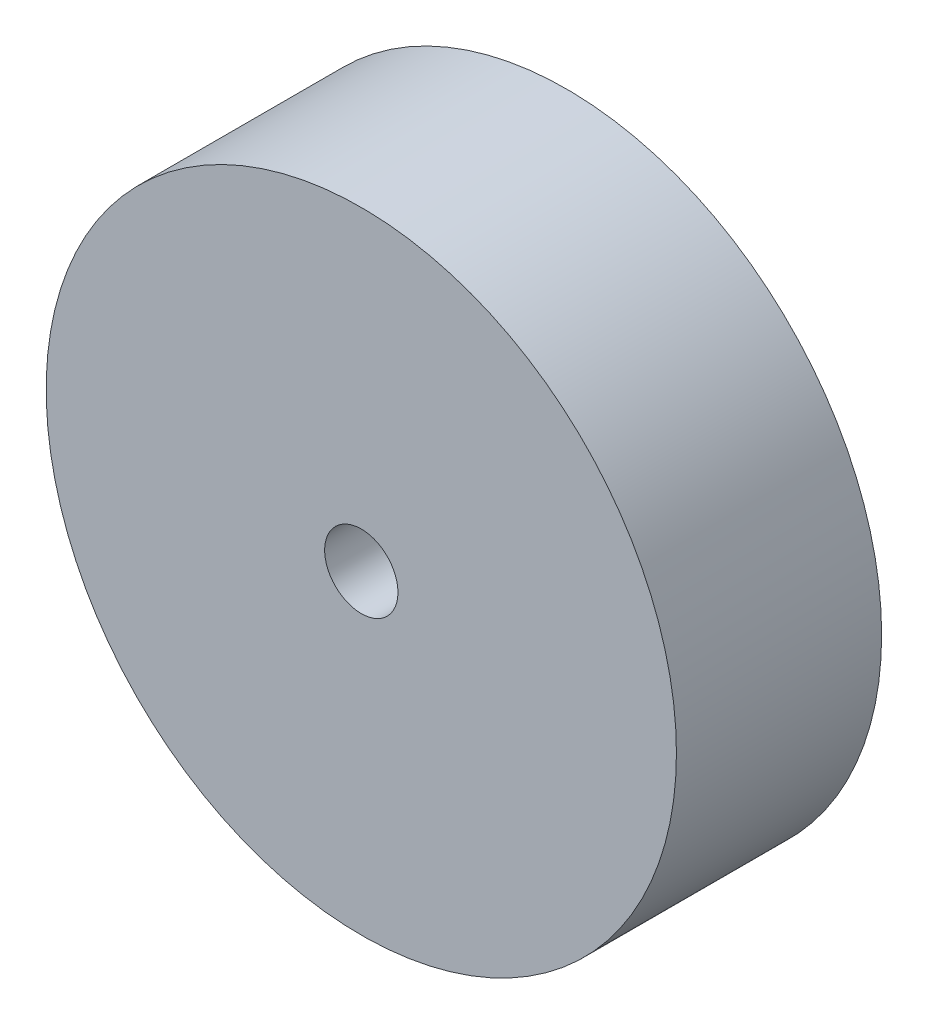
ISO-10303-21;
HEADER;
FILE_DESCRIPTION(('STEP AP214'),'2;1');
FILE_NAME('part.step','',(''),(''),'','','');
FILE_SCHEMA(('AUTOMOTIVE_DESIGN { 1 0 10303 214 1 1 1 1 }'));
ENDSEC;
DATA;
#1=APPLICATION_CONTEXT('core data for automotive mechanical design processes');
#2=APPLICATION_PROTOCOL_DEFINITION('international standard','automotive_design',2000,#1);
#3=PRODUCT_CONTEXT('',#1,'mechanical');
#4=PRODUCT('Part','Part','',(#3));
#5=PRODUCT_RELATED_PRODUCT_CATEGORY('part','',(#4));
#6=PRODUCT_DEFINITION_FORMATION('','',#4);
#7=PRODUCT_DEFINITION_CONTEXT('part definition',#1,'design');
#8=PRODUCT_DEFINITION('design','',#6,#7);
#9=PRODUCT_DEFINITION_SHAPE('','',#8);
#10=(LENGTH_UNIT() NAMED_UNIT(*) SI_UNIT(.MILLI.,.METRE.));
#11=(NAMED_UNIT(*) PLANE_ANGLE_UNIT() SI_UNIT($,.RADIAN.));
#12=(NAMED_UNIT(*) SI_UNIT($,.STERADIAN.) SOLID_ANGLE_UNIT());
#13=UNCERTAINTY_MEASURE_WITH_UNIT(LENGTH_MEASURE(1.E-05),#10,'distance_accuracy_value','');
#14=(GEOMETRIC_REPRESENTATION_CONTEXT(3) GLOBAL_UNCERTAINTY_ASSIGNED_CONTEXT((#13)) GLOBAL_UNIT_ASSIGNED_CONTEXT((#10,
#11,#12)) REPRESENTATION_CONTEXT('',''));
#15=CARTESIAN_POINT('',(0.,0.,0.));
#16=DIRECTION('',(0.,0.,1.));
#17=DIRECTION('',(1.,0.,0.));
#18=AXIS2_PLACEMENT_3D('',#15,#16,#17);
#19=CARTESIAN_POINT('',(0.,0.,14.));
#20=DIRECTION('',(0.,0.,1.));
#21=DIRECTION('',(1.,0.,0.));
#22=AXIS2_PLACEMENT_3D('',#19,#20,#21);
#23=PLANE('',#22);
#24=CARTESIAN_POINT('',(0.,0.,14.));
#25=DIRECTION('',(0.,0.,1.));
#26=DIRECTION('',(1.,0.,0.));
#27=AXIS2_PLACEMENT_3D('',#24,#25,#26);
#28=CIRCLE('',#27,21.5);
#29=CARTESIAN_POINT('',(21.5,0.,14.));
#30=VERTEX_POINT('',#29);
#31=EDGE_CURVE('E10',#30,#30,#28,.T.);
#32=ORIENTED_EDGE('',*,*,#31,.T.);
#33=EDGE_LOOP('',(#32));
#34=FACE_BOUND('',#33,.T.);
#35=CARTESIAN_POINT('',(0.,0.,14.));
#36=DIRECTION('',(0.,0.,1.));
#37=DIRECTION('',(1.,0.,0.));
#38=AXIS2_PLACEMENT_3D('',#35,#36,#37);
#39=CIRCLE('',#38,2.5);
#40=CARTESIAN_POINT('',(2.5,0.,14.));
#41=VERTEX_POINT('',#40);
#42=EDGE_CURVE('E49',#41,#41,#39,.T.);
#43=ORIENTED_EDGE('',*,*,#42,.F.);
#44=EDGE_LOOP('',(#43));
#45=FACE_BOUND('',#44,.T.);
#46=ADVANCED_FACE('F39',(#34,#45),#23,.T.);
#47=CARTESIAN_POINT('',(0.,0.,0.));
#48=DIRECTION('',(0.,0.,1.));
#49=DIRECTION('',(1.,0.,0.));
#50=AXIS2_PLACEMENT_3D('',#47,#48,#49);
#51=PLANE('',#50);
#52=CARTESIAN_POINT('',(0.,0.,0.));
#53=DIRECTION('',(0.,0.,1.));
#54=DIRECTION('',(1.,0.,0.));
#55=AXIS2_PLACEMENT_3D('',#52,#53,#54);
#56=CIRCLE('',#55,21.5);
#57=CARTESIAN_POINT('',(21.5,0.,0.));
#58=VERTEX_POINT('',#57);
#59=EDGE_CURVE('E43',#58,#58,#56,.T.);
#60=ORIENTED_EDGE('',*,*,#59,.F.);
#61=EDGE_LOOP('',(#60));
#62=FACE_BOUND('',#61,.T.);
#63=CARTESIAN_POINT('',(0.,0.,0.));
#64=DIRECTION('',(0.,0.,1.));
#65=DIRECTION('',(1.,0.,0.));
#66=AXIS2_PLACEMENT_3D('',#63,#64,#65);
#67=CIRCLE('',#66,2.5);
#68=CARTESIAN_POINT('',(2.5,0.,0.));
#69=VERTEX_POINT('',#68);
#70=EDGE_CURVE('E55',#69,#69,#67,.T.);
#71=ORIENTED_EDGE('',*,*,#70,.T.);
#72=EDGE_LOOP('',(#71));
#73=FACE_BOUND('',#72,.T.);
#74=ADVANCED_FACE('F62',(#62,#73),#51,.F.);
#75=CARTESIAN_POINT('',(0.,0.,14.));
#76=DIRECTION('',(0.,0.,-1.));
#77=DIRECTION('',(-1.,0.,0.));
#78=AXIS2_PLACEMENT_3D('',#75,#76,#77);
#79=CYLINDRICAL_SURFACE('',#78,21.5);
#80=ORIENTED_EDGE('',*,*,#31,.F.);
#81=EDGE_LOOP('',(#80));
#82=FACE_BOUND('',#81,.T.);
#83=ORIENTED_EDGE('',*,*,#59,.T.);
#84=EDGE_LOOP('',(#83));
#85=FACE_BOUND('',#84,.T.);
#86=ADVANCED_FACE('F41',(#82,#85),#79,.T.);
#87=CARTESIAN_POINT('',(0.,0.,14.));
#88=DIRECTION('',(0.,0.,-1.));
#89=DIRECTION('',(-1.,0.,0.));
#90=AXIS2_PLACEMENT_3D('',#87,#88,#89);
#91=CYLINDRICAL_SURFACE('',#90,2.5);
#92=ORIENTED_EDGE('',*,*,#42,.T.);
#93=EDGE_LOOP('',(#92));
#94=FACE_BOUND('',#93,.T.);
#95=ORIENTED_EDGE('',*,*,#70,.F.);
#96=EDGE_LOOP('',(#95));
#97=FACE_BOUND('',#96,.T.);
#98=ADVANCED_FACE('F59',(#94,#97),#91,.F.);
#99=CLOSED_SHELL('',(#46,#74,#86,#98));
#100=MANIFOLD_SOLID_BREP('B2',#99);
#101=ADVANCED_BREP_SHAPE_REPRESENTATION('',(#18,#100),#14);
#102=SHAPE_DEFINITION_REPRESENTATION(#9,#101);
ENDSEC;
END-ISO-10303-21;
